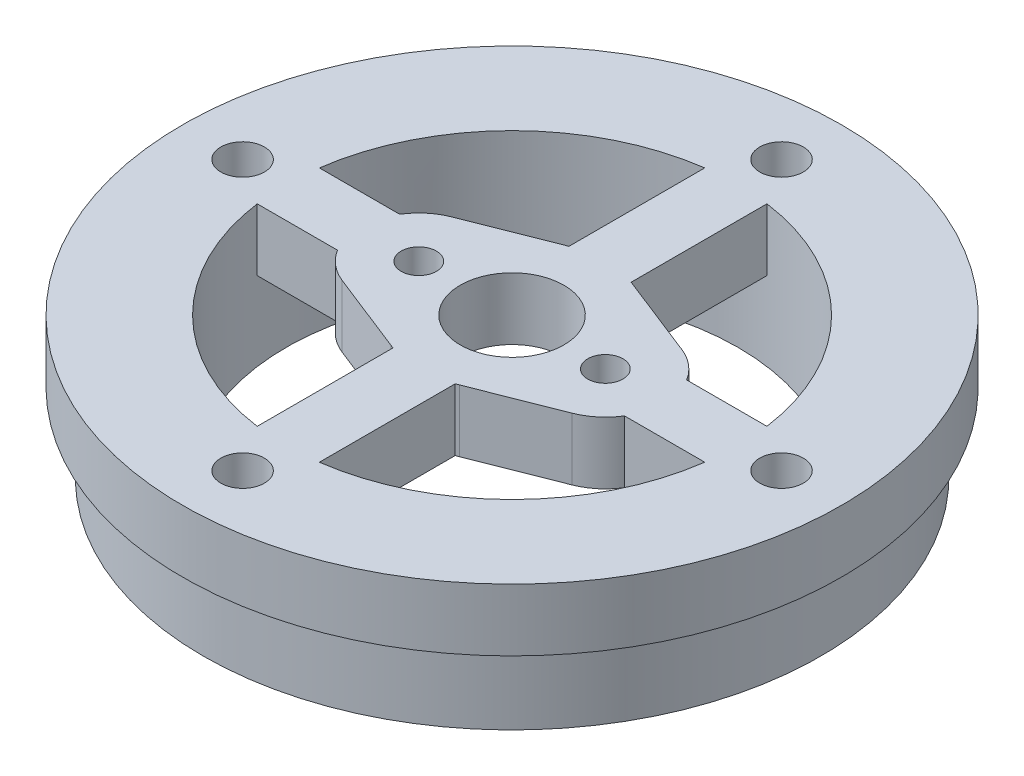
ISO-10303-21;
HEADER;
FILE_DESCRIPTION(('STEP AP214'),'2;1');
FILE_NAME('part.step','',(''),(''),'','','');
FILE_SCHEMA(('AUTOMOTIVE_DESIGN { 1 0 10303 214 1 1 1 1 }'));
ENDSEC;
DATA;
#1=APPLICATION_CONTEXT('core data for automotive mechanical design processes');
#2=APPLICATION_PROTOCOL_DEFINITION('international standard','automotive_design',2000,#1);
#3=PRODUCT_CONTEXT('',#1,'mechanical');
#4=PRODUCT('Part','Part','',(#3));
#5=PRODUCT_RELATED_PRODUCT_CATEGORY('part','',(#4));
#6=PRODUCT_DEFINITION_FORMATION('','',#4);
#7=PRODUCT_DEFINITION_CONTEXT('part definition',#1,'design');
#8=PRODUCT_DEFINITION('design','',#6,#7);
#9=PRODUCT_DEFINITION_SHAPE('','',#8);
#10=(LENGTH_UNIT() NAMED_UNIT(*) SI_UNIT(.MILLI.,.METRE.));
#11=(NAMED_UNIT(*) PLANE_ANGLE_UNIT() SI_UNIT($,.RADIAN.));
#12=(NAMED_UNIT(*) SI_UNIT($,.STERADIAN.) SOLID_ANGLE_UNIT());
#13=UNCERTAINTY_MEASURE_WITH_UNIT(LENGTH_MEASURE(1.E-05),#10,'distance_accuracy_value','');
#14=(GEOMETRIC_REPRESENTATION_CONTEXT(3) GLOBAL_UNCERTAINTY_ASSIGNED_CONTEXT((#13)) GLOBAL_UNIT_ASSIGNED_CONTEXT((#10,
#11,#12)) REPRESENTATION_CONTEXT('',''));
#15=CARTESIAN_POINT('',(0.,0.,0.));
#16=DIRECTION('',(0.,0.,1.));
#17=DIRECTION('',(1.,0.,0.));
#18=AXIS2_PLACEMENT_3D('',#15,#16,#17);
#19=CARTESIAN_POINT('',(10.9,3.8,0.));
#20=DIRECTION('',(0.,-1.,0.));
#21=DIRECTION('',(0.,0.,-1.));
#22=AXIS2_PLACEMENT_3D('',#19,#20,#21);
#23=PLANE('',#22);
#24=CARTESIAN_POINT('',(4.5,3.8,0.));
#25=DIRECTION('',(0.,-1.,0.));
#26=DIRECTION('',(0.,0.,-1.));
#27=AXIS2_PLACEMENT_3D('',#24,#25,#26);
#28=CIRCLE('',#27,0.849999999999999);
#29=CARTESIAN_POINT('',(4.5,3.8,-0.849999999999999));
#30=VERTEX_POINT('',#29);
#31=EDGE_CURVE('E317',#30,#30,#28,.T.);
#32=ORIENTED_EDGE('',*,*,#31,.F.);
#33=EDGE_LOOP('',(#32));
#34=FACE_BOUND('',#33,.T.);
#35=CARTESIAN_POINT('',(-4.5,3.8,0.));
#36=DIRECTION('',(0.,-1.,0.));
#37=DIRECTION('',(0.,0.,-1.));
#38=AXIS2_PLACEMENT_3D('',#35,#36,#37);
#39=CIRCLE('',#38,0.849999999999999);
#40=CARTESIAN_POINT('',(-4.5,3.8,-0.849999999999999));
#41=VERTEX_POINT('',#40);
#42=EDGE_CURVE('E324',#41,#41,#39,.T.);
#43=ORIENTED_EDGE('',*,*,#42,.F.);
#44=EDGE_LOOP('',(#43));
#45=FACE_BOUND('',#44,.T.);
#46=CARTESIAN_POINT('',(0.,3.8,0.));
#47=DIRECTION('',(0.,-1.,0.));
#48=DIRECTION('',(0.,0.,-1.));
#49=AXIS2_PLACEMENT_3D('',#46,#47,#48);
#50=CIRCLE('',#49,2.5);
#51=CARTESIAN_POINT('',(0.,3.8,-2.5));
#52=VERTEX_POINT('',#51);
#53=EDGE_CURVE('E229',#52,#52,#50,.T.);
#54=ORIENTED_EDGE('',*,*,#53,.F.);
#55=EDGE_LOOP('',(#54));
#56=FACE_BOUND('',#55,.T.);
#57=CARTESIAN_POINT('',(0.,3.8,0.));
#58=DIRECTION('',(0.,-1.,0.));
#59=DIRECTION('',(0.,0.,-1.));
#60=AXIS2_PLACEMENT_3D('',#57,#58,#59);
#61=CIRCLE('',#60,4.5);
#62=CARTESIAN_POINT('',(-1.65,3.8,-4.18658572108586));
#63=VERTEX_POINT('',#62);
#64=CARTESIAN_POINT('',(-1.5,3.8,-4.24264068711929));
#65=VERTEX_POINT('',#64);
#66=EDGE_CURVE('E55',#63,#65,#61,.T.);
#67=ORIENTED_EDGE('',*,*,#66,.T.);
#68=DIRECTION('',(0.,0.,-1.));
#69=VECTOR('',#68,1.);
#70=CARTESIAN_POINT('',(-1.5,3.8,0.));
#71=LINE('',#70,#69);
#72=CARTESIAN_POINT('',(-1.5,3.8,-10.7962956610126));
#73=VERTEX_POINT('',#72);
#74=EDGE_CURVE('E230',#65,#73,#71,.T.);
#75=ORIENTED_EDGE('',*,*,#74,.T.);
#76=CARTESIAN_POINT('',(0.,3.8,0.));
#77=DIRECTION('',(0.,-1.,0.));
#78=DIRECTION('',(0.,0.,-1.));
#79=AXIS2_PLACEMENT_3D('',#76,#77,#78);
#80=CIRCLE('',#79,10.9);
#81=CARTESIAN_POINT('',(1.5,3.8,-10.7962956610126));
#82=VERTEX_POINT('',#81);
#83=EDGE_CURVE('E206',#73,#82,#80,.T.);
#84=ORIENTED_EDGE('',*,*,#83,.T.);
#85=DIRECTION('',(0.,0.,-1.));
#86=VECTOR('',#85,1.);
#87=CARTESIAN_POINT('',(1.5,3.8,0.));
#88=LINE('',#87,#86);
#89=CARTESIAN_POINT('',(1.5,3.8,-4.24264068711929));
#90=VERTEX_POINT('',#89);
#91=EDGE_CURVE('E220',#90,#82,#88,.T.);
#92=ORIENTED_EDGE('',*,*,#91,.F.);
#93=CARTESIAN_POINT('',(0.,3.8,0.));
#94=DIRECTION('',(0.,-1.,0.));
#95=DIRECTION('',(0.,0.,-1.));
#96=AXIS2_PLACEMENT_3D('',#93,#94,#95);
#97=CIRCLE('',#96,4.5);
#98=CARTESIAN_POINT('',(1.65,3.8,-4.18658572108586));
#99=VERTEX_POINT('',#98);
#100=EDGE_CURVE('E224',#90,#99,#97,.T.);
#101=ORIENTED_EDGE('',*,*,#100,.T.);
#102=DIRECTION('',(-0.930352382463524,0.,-0.366666666666667));
#103=VECTOR('',#102,1.);
#104=CARTESIAN_POINT('',(1.65,3.8,-4.18658572108586));
#105=LINE('',#104,#103);
#106=CARTESIAN_POINT('',(5.545,3.8,-2.65150429002104));
#107=VERTEX_POINT('',#106);
#108=EDGE_CURVE('E768',#107,#99,#105,.T.);
#109=ORIENTED_EDGE('',*,*,#108,.F.);
#110=CARTESIAN_POINT('',(4.5,3.8,0.));
#111=DIRECTION('',(0.,-1.,0.));
#112=DIRECTION('',(0.,0.,-1.));
#113=AXIS2_PLACEMENT_3D('',#110,#111,#112);
#114=CIRCLE('',#113,2.85);
#115=CARTESIAN_POINT('',(6.92332416321053,3.8,-1.5));
#116=VERTEX_POINT('',#115);
#117=EDGE_CURVE('E761',#107,#116,#114,.T.);
#118=ORIENTED_EDGE('',*,*,#117,.T.);
#119=DIRECTION('',(1.,0.,0.));
#120=VECTOR('',#119,1.);
#121=CARTESIAN_POINT('',(0.,3.8,-1.50000000000001));
#122=LINE('',#121,#120);
#123=CARTESIAN_POINT('',(10.7962956610126,3.8,-1.5));
#124=VERTEX_POINT('',#123);
#125=EDGE_CURVE('E225',#116,#124,#122,.T.);
#126=ORIENTED_EDGE('',*,*,#125,.T.);
#127=CARTESIAN_POINT('',(10.7962956610126,3.8,1.5));
#128=VERTEX_POINT('',#127);
#129=EDGE_CURVE('E231',#124,#128,#80,.T.);
#130=ORIENTED_EDGE('',*,*,#129,.T.);
#131=DIRECTION('',(1.,0.,0.));
#132=VECTOR('',#131,1.);
#133=CARTESIAN_POINT('',(0.,3.8,1.5));
#134=LINE('',#133,#132);
#135=CARTESIAN_POINT('',(6.92332416321053,3.8,1.5));
#136=VERTEX_POINT('',#135);
#137=EDGE_CURVE('E473',#136,#128,#134,.T.);
#138=ORIENTED_EDGE('',*,*,#137,.F.);
#139=CARTESIAN_POINT('',(4.5,3.8,0.));
#140=DIRECTION('',(0.,-1.,0.));
#141=DIRECTION('',(0.,0.,-1.));
#142=AXIS2_PLACEMENT_3D('',#139,#140,#141);
#143=CIRCLE('',#142,2.85);
#144=CARTESIAN_POINT('',(5.545,3.8,2.65150429002104));
#145=VERTEX_POINT('',#144);
#146=EDGE_CURVE('E467',#136,#145,#143,.T.);
#147=ORIENTED_EDGE('',*,*,#146,.T.);
#148=DIRECTION('',(0.930352382463524,0.,-0.366666666666667));
#149=VECTOR('',#148,1.);
#150=CARTESIAN_POINT('',(1.65,3.8,4.18658572108586));
#151=LINE('',#150,#149);
#152=CARTESIAN_POINT('',(1.65,3.8,4.18658572108586));
#153=VERTEX_POINT('',#152);
#154=EDGE_CURVE('E464',#153,#145,#151,.T.);
#155=ORIENTED_EDGE('',*,*,#154,.F.);
#156=CARTESIAN_POINT('',(0.,3.8,0.));
#157=DIRECTION('',(0.,-1.,0.));
#158=DIRECTION('',(0.,0.,-1.));
#159=AXIS2_PLACEMENT_3D('',#156,#157,#158);
#160=CIRCLE('',#159,4.5);
#161=CARTESIAN_POINT('',(1.5,3.8,4.24264068711929));
#162=VERTEX_POINT('',#161);
#163=EDGE_CURVE('E58',#153,#162,#160,.T.);
#164=ORIENTED_EDGE('',*,*,#163,.T.);
#165=DIRECTION('',(0.,0.,1.));
#166=VECTOR('',#165,1.);
#167=CARTESIAN_POINT('',(1.5,3.8,0.));
#168=LINE('',#167,#166);
#169=CARTESIAN_POINT('',(1.5,3.8,10.7962956610126));
#170=VERTEX_POINT('',#169);
#171=EDGE_CURVE('E252',#162,#170,#168,.T.);
#172=ORIENTED_EDGE('',*,*,#171,.T.);
#173=CARTESIAN_POINT('',(-1.5,3.8,10.7962956610126));
#174=VERTEX_POINT('',#173);
#175=EDGE_CURVE('E232',#170,#174,#80,.T.);
#176=ORIENTED_EDGE('',*,*,#175,.T.);
#177=DIRECTION('',(0.,0.,1.));
#178=VECTOR('',#177,1.);
#179=CARTESIAN_POINT('',(-1.5,3.8,0.));
#180=LINE('',#179,#178);
#181=CARTESIAN_POINT('',(-1.5,3.8,4.24264068711929));
#182=VERTEX_POINT('',#181);
#183=EDGE_CURVE('E249',#182,#174,#180,.T.);
#184=ORIENTED_EDGE('',*,*,#183,.F.);
#185=CARTESIAN_POINT('',(0.,3.8,0.));
#186=DIRECTION('',(0.,-1.,0.));
#187=DIRECTION('',(0.,0.,-1.));
#188=AXIS2_PLACEMENT_3D('',#185,#186,#187);
#189=CIRCLE('',#188,4.5);
#190=CARTESIAN_POINT('',(-1.65,3.8,4.18658572108586));
#191=VERTEX_POINT('',#190);
#192=EDGE_CURVE('E269',#182,#191,#189,.T.);
#193=ORIENTED_EDGE('',*,*,#192,.T.);
#194=DIRECTION('',(-0.930352382463524,0.,-0.366666666666667));
#195=VECTOR('',#194,1.);
#196=CARTESIAN_POINT('',(-1.65,3.8,4.18658572108586));
#197=LINE('',#196,#195);
#198=CARTESIAN_POINT('',(-5.545,3.8,2.65150429002104));
#199=VERTEX_POINT('',#198);
#200=EDGE_CURVE('E282',#191,#199,#197,.T.);
#201=ORIENTED_EDGE('',*,*,#200,.T.);
#202=CARTESIAN_POINT('',(-4.5,3.8,0.));
#203=DIRECTION('',(0.,-1.,0.));
#204=DIRECTION('',(0.,0.,-1.));
#205=AXIS2_PLACEMENT_3D('',#202,#203,#204);
#206=CIRCLE('',#205,2.85);
#207=CARTESIAN_POINT('',(-6.92332416321053,3.8,1.5));
#208=VERTEX_POINT('',#207);
#209=EDGE_CURVE('E272',#199,#208,#206,.T.);
#210=ORIENTED_EDGE('',*,*,#209,.T.);
#211=DIRECTION('',(-1.,0.,0.));
#212=VECTOR('',#211,1.);
#213=CARTESIAN_POINT('',(0.,3.8,1.5));
#214=LINE('',#213,#212);
#215=CARTESIAN_POINT('',(-10.7962956610126,3.8,1.5));
#216=VERTEX_POINT('',#215);
#217=EDGE_CURVE('E267',#208,#216,#214,.T.);
#218=ORIENTED_EDGE('',*,*,#217,.T.);
#219=CARTESIAN_POINT('',(-10.7962956610126,3.8,-1.5));
#220=VERTEX_POINT('',#219);
#221=EDGE_CURVE('E228',#216,#220,#80,.T.);
#222=ORIENTED_EDGE('',*,*,#221,.T.);
#223=DIRECTION('',(-1.,0.,0.));
#224=VECTOR('',#223,1.);
#225=CARTESIAN_POINT('',(0.,3.8,-1.5));
#226=LINE('',#225,#224);
#227=CARTESIAN_POINT('',(-6.92332416321053,3.8,-1.5));
#228=VERTEX_POINT('',#227);
#229=EDGE_CURVE('E740',#228,#220,#226,.T.);
#230=ORIENTED_EDGE('',*,*,#229,.F.);
#231=CARTESIAN_POINT('',(-4.5,3.8,0.));
#232=DIRECTION('',(0.,-1.,0.));
#233=DIRECTION('',(0.,0.,-1.));
#234=AXIS2_PLACEMENT_3D('',#231,#232,#233);
#235=CIRCLE('',#234,2.85);
#236=CARTESIAN_POINT('',(-5.545,3.8,-2.65150429002104));
#237=VERTEX_POINT('',#236);
#238=EDGE_CURVE('E733',#228,#237,#235,.T.);
#239=ORIENTED_EDGE('',*,*,#238,.T.);
#240=DIRECTION('',(0.930352382463524,0.,-0.366666666666667));
#241=VECTOR('',#240,1.);
#242=CARTESIAN_POINT('',(-1.65,3.8,-4.18658572108586));
#243=LINE('',#242,#241);
#244=EDGE_CURVE('E732',#237,#63,#243,.T.);
#245=ORIENTED_EDGE('',*,*,#244,.T.);
#246=EDGE_LOOP('',(#67,#75,#84,#92,#101,#109,#118,#126,#130,#138,#147,#155,#164,#172,#176,#184,
#193,#201,#210,#218,#222,#230,#239,#245));
#247=FACE_BOUND('',#246,.T.);
#248=ADVANCED_FACE('F40',(#34,#45,#56,#247),#23,.T.);
#249=CARTESIAN_POINT('',(2.5,6.8,0.));
#250=DIRECTION('',(0.,1.,0.));
#251=DIRECTION('',(0.,0.,1.));
#252=AXIS2_PLACEMENT_3D('',#249,#250,#251);
#253=PLANE('',#252);
#254=CARTESIAN_POINT('',(13.,6.8,0.));
#255=DIRECTION('',(0.,-1.,0.));
#256=DIRECTION('',(0.,0.,-1.));
#257=AXIS2_PLACEMENT_3D('',#254,#255,#256);
#258=CIRCLE('',#257,1.05);
#259=CARTESIAN_POINT('',(13.,6.8,-1.05));
#260=VERTEX_POINT('',#259);
#261=EDGE_CURVE('E293',#260,#260,#258,.T.);
#262=ORIENTED_EDGE('',*,*,#261,.T.);
#263=EDGE_LOOP('',(#262));
#264=FACE_BOUND('',#263,.T.);
#265=CARTESIAN_POINT('',(0.,6.8,-13.));
#266=DIRECTION('',(0.,-1.,0.));
#267=DIRECTION('',(0.,0.,-1.));
#268=AXIS2_PLACEMENT_3D('',#265,#266,#267);
#269=CIRCLE('',#268,1.05);
#270=CARTESIAN_POINT('',(0.,6.8,-14.05));
#271=VERTEX_POINT('',#270);
#272=EDGE_CURVE('E301',#271,#271,#269,.T.);
#273=ORIENTED_EDGE('',*,*,#272,.T.);
#274=EDGE_LOOP('',(#273));
#275=FACE_BOUND('',#274,.T.);
#276=CARTESIAN_POINT('',(-13.,6.8,0.));
#277=DIRECTION('',(0.,-1.,0.));
#278=DIRECTION('',(0.,0.,-1.));
#279=AXIS2_PLACEMENT_3D('',#276,#277,#278);
#280=CIRCLE('',#279,1.05);
#281=CARTESIAN_POINT('',(-13.,6.8,-1.05));
#282=VERTEX_POINT('',#281);
#283=EDGE_CURVE('E307',#282,#282,#280,.T.);
#284=ORIENTED_EDGE('',*,*,#283,.T.);
#285=EDGE_LOOP('',(#284));
#286=FACE_BOUND('',#285,.T.);
#287=CARTESIAN_POINT('',(0.,6.8,13.));
#288=DIRECTION('',(0.,-1.,0.));
#289=DIRECTION('',(0.,0.,-1.));
#290=AXIS2_PLACEMENT_3D('',#287,#288,#289);
#291=CIRCLE('',#290,1.05);
#292=CARTESIAN_POINT('',(0.,6.8,11.95));
#293=VERTEX_POINT('',#292);
#294=EDGE_CURVE('E311',#293,#293,#291,.T.);
#295=ORIENTED_EDGE('',*,*,#294,.T.);
#296=EDGE_LOOP('',(#295));
#297=FACE_BOUND('',#296,.T.);
#298=CARTESIAN_POINT('',(4.5,6.8,0.));
#299=DIRECTION('',(0.,1.,0.));
#300=DIRECTION('',(0.,0.,1.));
#301=AXIS2_PLACEMENT_3D('',#298,#299,#300);
#302=CIRCLE('',#301,0.849999999999999);
#303=CARTESIAN_POINT('',(4.5,6.8,0.849999999999999));
#304=VERTEX_POINT('',#303);
#305=EDGE_CURVE('E316',#304,#304,#302,.T.);
#306=ORIENTED_EDGE('',*,*,#305,.F.);
#307=EDGE_LOOP('',(#306));
#308=FACE_BOUND('',#307,.T.);
#309=CARTESIAN_POINT('',(-4.5,6.8,0.));
#310=DIRECTION('',(0.,1.,0.));
#311=DIRECTION('',(0.,0.,1.));
#312=AXIS2_PLACEMENT_3D('',#309,#310,#311);
#313=CIRCLE('',#312,0.849999999999999);
#314=CARTESIAN_POINT('',(-4.5,6.8,0.849999999999999));
#315=VERTEX_POINT('',#314);
#316=EDGE_CURVE('E325',#315,#315,#313,.T.);
#317=ORIENTED_EDGE('',*,*,#316,.F.);
#318=EDGE_LOOP('',(#317));
#319=FACE_BOUND('',#318,.T.);
#320=CARTESIAN_POINT('',(0.,6.8,0.));
#321=DIRECTION('',(0.,-1.,0.));
#322=DIRECTION('',(0.,0.,-1.));
#323=AXIS2_PLACEMENT_3D('',#320,#321,#322);
#324=CIRCLE('',#323,2.5);
#325=CARTESIAN_POINT('',(0.,6.8,-2.5));
#326=VERTEX_POINT('',#325);
#327=EDGE_CURVE('E234',#326,#326,#324,.T.);
#328=ORIENTED_EDGE('',*,*,#327,.T.);
#329=EDGE_LOOP('',(#328));
#330=FACE_BOUND('',#329,.T.);
#331=CARTESIAN_POINT('',(0.,6.8,0.));
#332=DIRECTION('',(0.,-1.,0.));
#333=DIRECTION('',(0.,0.,-1.));
#334=AXIS2_PLACEMENT_3D('',#331,#332,#333);
#335=CIRCLE('',#334,15.9);
#336=CARTESIAN_POINT('',(0.,6.8,-15.9));
#337=VERTEX_POINT('',#336);
#338=EDGE_CURVE('E327',#337,#337,#335,.T.);
#339=ORIENTED_EDGE('',*,*,#338,.F.);
#340=EDGE_LOOP('',(#339));
#341=FACE_BOUND('',#340,.T.);
#342=DIRECTION('',(0.930352382463524,0.,0.366666666666667));
#343=VECTOR('',#342,1.);
#344=CARTESIAN_POINT('',(0.513888888888883,6.8,5.03940873834409));
#345=LINE('',#344,#343);
#346=CARTESIAN_POINT('',(-5.545,6.8,2.65150429002104));
#347=VERTEX_POINT('',#346);
#348=CARTESIAN_POINT('',(-1.65,6.8,4.18658572108586));
#349=VERTEX_POINT('',#348);
#350=EDGE_CURVE('E397',#347,#349,#345,.T.);
#351=ORIENTED_EDGE('',*,*,#350,.T.);
#352=CARTESIAN_POINT('',(0.,6.8,0.));
#353=DIRECTION('',(0.,1.,0.));
#354=DIRECTION('',(0.,0.,1.));
#355=AXIS2_PLACEMENT_3D('',#352,#353,#354);
#356=CIRCLE('',#355,4.5);
#357=CARTESIAN_POINT('',(-1.5,6.8,4.24264068711929));
#358=VERTEX_POINT('',#357);
#359=EDGE_CURVE('E402',#349,#358,#356,.T.);
#360=ORIENTED_EDGE('',*,*,#359,.T.);
#361=DIRECTION('',(0.,0.,-1.));
#362=VECTOR('',#361,1.);
#363=CARTESIAN_POINT('',(-1.5,6.8,0.));
#364=LINE('',#363,#362);
#365=CARTESIAN_POINT('',(-1.5,6.8,10.7962956610126));
#366=VERTEX_POINT('',#365);
#367=EDGE_CURVE('E384',#366,#358,#364,.T.);
#368=ORIENTED_EDGE('',*,*,#367,.F.);
#369=CARTESIAN_POINT('',(0.,6.8,0.));
#370=DIRECTION('',(0.,1.,0.));
#371=DIRECTION('',(0.,0.,1.));
#372=AXIS2_PLACEMENT_3D('',#369,#370,#371);
#373=CIRCLE('',#372,10.9);
#374=CARTESIAN_POINT('',(-10.7962956610126,6.8,1.5));
#375=VERTEX_POINT('',#374);
#376=EDGE_CURVE('E257',#375,#366,#373,.T.);
#377=ORIENTED_EDGE('',*,*,#376,.F.);
#378=DIRECTION('',(1.,0.,0.));
#379=VECTOR('',#378,1.);
#380=CARTESIAN_POINT('',(2.5,6.8,1.5));
#381=LINE('',#380,#379);
#382=CARTESIAN_POINT('',(-6.92332416321053,6.8,1.5));
#383=VERTEX_POINT('',#382);
#384=EDGE_CURVE('E395',#375,#383,#381,.T.);
#385=ORIENTED_EDGE('',*,*,#384,.T.);
#386=CARTESIAN_POINT('',(-4.5,6.8,0.));
#387=DIRECTION('',(0.,1.,0.));
#388=DIRECTION('',(0.,0.,1.));
#389=AXIS2_PLACEMENT_3D('',#386,#387,#388);
#390=CIRCLE('',#389,2.85);
#391=EDGE_CURVE('E391',#383,#347,#390,.T.);
#392=ORIENTED_EDGE('',*,*,#391,.T.);
#393=EDGE_LOOP('',(#351,#360,#368,#377,#385,#392));
#394=FACE_BOUND('',#393,.T.);
#395=DIRECTION('',(0.930352382463524,0.,0.366666666666667));
#396=VECTOR('',#395,1.);
#397=CARTESIAN_POINT('',(3.81388888888889,6.8,-3.33376270382763));
#398=LINE('',#397,#396);
#399=CARTESIAN_POINT('',(1.65,6.8,-4.18658572108586));
#400=VERTEX_POINT('',#399);
#401=CARTESIAN_POINT('',(5.545,6.8,-2.65150429002104));
#402=VERTEX_POINT('',#401);
#403=EDGE_CURVE('E412',#400,#402,#398,.T.);
#404=ORIENTED_EDGE('',*,*,#403,.F.);
#405=CARTESIAN_POINT('',(0.,6.8,0.));
#406=DIRECTION('',(0.,1.,0.));
#407=DIRECTION('',(0.,0.,1.));
#408=AXIS2_PLACEMENT_3D('',#405,#406,#407);
#409=CIRCLE('',#408,4.5);
#410=CARTESIAN_POINT('',(1.5,6.8,-4.24264068711929));
#411=VERTEX_POINT('',#410);
#412=EDGE_CURVE('E414',#400,#411,#409,.T.);
#413=ORIENTED_EDGE('',*,*,#412,.T.);
#414=DIRECTION('',(0.,0.,1.));
#415=VECTOR('',#414,1.);
#416=CARTESIAN_POINT('',(1.5,6.8,0.));
#417=LINE('',#416,#415);
#418=CARTESIAN_POINT('',(1.5,6.8,-10.7962956610126));
#419=VERTEX_POINT('',#418);
#420=EDGE_CURVE('E404',#419,#411,#417,.T.);
#421=ORIENTED_EDGE('',*,*,#420,.F.);
#422=CARTESIAN_POINT('',(0.,6.8,0.));
#423=DIRECTION('',(0.,1.,0.));
#424=DIRECTION('',(0.,0.,1.));
#425=AXIS2_PLACEMENT_3D('',#422,#423,#424);
#426=CIRCLE('',#425,10.9);
#427=CARTESIAN_POINT('',(10.7962956610126,6.8,-1.5));
#428=VERTEX_POINT('',#427);
#429=EDGE_CURVE('E207',#428,#419,#426,.T.);
#430=ORIENTED_EDGE('',*,*,#429,.F.);
#431=DIRECTION('',(-1.,0.,0.));
#432=VECTOR('',#431,1.);
#433=CARTESIAN_POINT('',(2.5,6.8,-1.50000000000001));
#434=LINE('',#433,#432);
#435=CARTESIAN_POINT('',(6.92332416321053,6.8,-1.5));
#436=VERTEX_POINT('',#435);
#437=EDGE_CURVE('E410',#428,#436,#434,.T.);
#438=ORIENTED_EDGE('',*,*,#437,.T.);
#439=CARTESIAN_POINT('',(4.5,6.8,0.));
#440=DIRECTION('',(0.,1.,0.));
#441=DIRECTION('',(0.,0.,1.));
#442=AXIS2_PLACEMENT_3D('',#439,#440,#441);
#443=CIRCLE('',#442,2.85);
#444=EDGE_CURVE('E406',#436,#402,#443,.T.);
#445=ORIENTED_EDGE('',*,*,#444,.T.);
#446=EDGE_LOOP('',(#404,#413,#421,#430,#438,#445));
#447=FACE_BOUND('',#446,.T.);
#448=DIRECTION('',(0.,0.,-1.));
#449=VECTOR('',#448,1.);
#450=CARTESIAN_POINT('',(1.5,6.8,0.));
#451=LINE('',#450,#449);
#452=CARTESIAN_POINT('',(1.5,6.8,10.7962956610126));
#453=VERTEX_POINT('',#452);
#454=CARTESIAN_POINT('',(1.5,6.8,4.24264068711929));
#455=VERTEX_POINT('',#454);
#456=EDGE_CURVE('E430',#453,#455,#451,.T.);
#457=ORIENTED_EDGE('',*,*,#456,.T.);
#458=CARTESIAN_POINT('',(0.,6.8,0.));
#459=DIRECTION('',(0.,1.,0.));
#460=DIRECTION('',(0.,0.,1.));
#461=AXIS2_PLACEMENT_3D('',#458,#459,#460);
#462=CIRCLE('',#461,4.5);
#463=CARTESIAN_POINT('',(1.65,6.8,4.18658572108586));
#464=VERTEX_POINT('',#463);
#465=EDGE_CURVE('E429',#455,#464,#462,.T.);
#466=ORIENTED_EDGE('',*,*,#465,.T.);
#467=DIRECTION('',(-0.930352382463524,0.,0.366666666666667));
#468=VECTOR('',#467,1.);
#469=CARTESIAN_POINT('',(3.81388888888889,6.8,3.33376270382763));
#470=LINE('',#469,#468);
#471=CARTESIAN_POINT('',(5.545,6.8,2.65150429002104));
#472=VERTEX_POINT('',#471);
#473=EDGE_CURVE('E416',#472,#464,#470,.T.);
#474=ORIENTED_EDGE('',*,*,#473,.F.);
#475=CARTESIAN_POINT('',(4.5,6.8,0.));
#476=DIRECTION('',(0.,1.,0.));
#477=DIRECTION('',(0.,0.,1.));
#478=AXIS2_PLACEMENT_3D('',#475,#476,#477);
#479=CIRCLE('',#478,2.85);
#480=CARTESIAN_POINT('',(6.92332416321053,6.8,1.5));
#481=VERTEX_POINT('',#480);
#482=EDGE_CURVE('E419',#472,#481,#479,.T.);
#483=ORIENTED_EDGE('',*,*,#482,.T.);
#484=DIRECTION('',(-1.,0.,0.));
#485=VECTOR('',#484,1.);
#486=CARTESIAN_POINT('',(2.5,6.8,1.5));
#487=LINE('',#486,#485);
#488=CARTESIAN_POINT('',(10.7962956610126,6.8,1.5));
#489=VERTEX_POINT('',#488);
#490=EDGE_CURVE('E421',#489,#481,#487,.T.);
#491=ORIENTED_EDGE('',*,*,#490,.F.);
#492=CARTESIAN_POINT('',(0.,6.8,0.));
#493=DIRECTION('',(0.,1.,0.));
#494=DIRECTION('',(0.,0.,1.));
#495=AXIS2_PLACEMENT_3D('',#492,#493,#494);
#496=CIRCLE('',#495,10.9);
#497=EDGE_CURVE('E422',#453,#489,#496,.T.);
#498=ORIENTED_EDGE('',*,*,#497,.F.);
#499=EDGE_LOOP('',(#457,#466,#474,#483,#491,#498));
#500=FACE_BOUND('',#499,.T.);
#501=DIRECTION('',(0.,0.,1.));
#502=VECTOR('',#501,1.);
#503=CARTESIAN_POINT('',(-1.5,6.8,0.));
#504=LINE('',#503,#502);
#505=CARTESIAN_POINT('',(-1.5,6.8,-10.7962956610126));
#506=VERTEX_POINT('',#505);
#507=CARTESIAN_POINT('',(-1.5,6.8,-4.24264068711929));
#508=VERTEX_POINT('',#507);
#509=EDGE_CURVE('E44',#506,#508,#504,.T.);
#510=ORIENTED_EDGE('',*,*,#509,.T.);
#511=CARTESIAN_POINT('',(0.,6.8,0.));
#512=DIRECTION('',(0.,1.,0.));
#513=DIRECTION('',(0.,0.,1.));
#514=AXIS2_PLACEMENT_3D('',#511,#512,#513);
#515=CIRCLE('',#514,4.5);
#516=CARTESIAN_POINT('',(-1.65,6.8,-4.18658572108586));
#517=VERTEX_POINT('',#516);
#518=EDGE_CURVE('E11',#508,#517,#515,.T.);
#519=ORIENTED_EDGE('',*,*,#518,.T.);
#520=DIRECTION('',(-0.930352382463524,0.,0.366666666666667));
#521=VECTOR('',#520,1.);
#522=CARTESIAN_POINT('',(0.513888888888886,6.8,-5.03940873834409));
#523=LINE('',#522,#521);
#524=CARTESIAN_POINT('',(-5.545,6.8,-2.65150429002104));
#525=VERTEX_POINT('',#524);
#526=EDGE_CURVE('E433',#517,#525,#523,.T.);
#527=ORIENTED_EDGE('',*,*,#526,.T.);
#528=CARTESIAN_POINT('',(-4.5,6.8,0.));
#529=DIRECTION('',(0.,1.,0.));
#530=DIRECTION('',(0.,0.,1.));
#531=AXIS2_PLACEMENT_3D('',#528,#529,#530);
#532=CIRCLE('',#531,2.85);
#533=CARTESIAN_POINT('',(-6.92332416321053,6.8,-1.5));
#534=VERTEX_POINT('',#533);
#535=EDGE_CURVE('E436',#525,#534,#532,.T.);
#536=ORIENTED_EDGE('',*,*,#535,.T.);
#537=DIRECTION('',(1.,0.,0.));
#538=VECTOR('',#537,1.);
#539=CARTESIAN_POINT('',(2.5,6.8,-1.5));
#540=LINE('',#539,#538);
#541=CARTESIAN_POINT('',(-10.7962956610126,6.8,-1.5));
#542=VERTEX_POINT('',#541);
#543=EDGE_CURVE('E438',#542,#534,#540,.T.);
#544=ORIENTED_EDGE('',*,*,#543,.F.);
#545=CARTESIAN_POINT('',(0.,6.8,0.));
#546=DIRECTION('',(0.,1.,0.));
#547=DIRECTION('',(0.,0.,1.));
#548=AXIS2_PLACEMENT_3D('',#545,#546,#547);
#549=CIRCLE('',#548,10.9);
#550=EDGE_CURVE('E442',#506,#542,#549,.T.);
#551=ORIENTED_EDGE('',*,*,#550,.F.);
#552=EDGE_LOOP('',(#510,#519,#527,#536,#544,#551));
#553=FACE_BOUND('',#552,.T.);
#554=ADVANCED_FACE('F331',(#264,#275,#286,#297,#308,#319,#330,#341,#394,#447,#500,#553),#253,.T.);
#555=CARTESIAN_POINT('',(0.,0.,0.));
#556=DIRECTION('',(0.,-1.,0.));
#557=DIRECTION('',(0.,0.,-1.));
#558=AXIS2_PLACEMENT_3D('',#555,#556,#557);
#559=CYLINDRICAL_SURFACE('',#558,15.9);
#560=ORIENTED_EDGE('',*,*,#338,.T.);
#561=EDGE_LOOP('',(#560));
#562=FACE_BOUND('',#561,.T.);
#563=CARTESIAN_POINT('',(0.,3.8,0.));
#564=DIRECTION('',(0.,-1.,0.));
#565=DIRECTION('',(0.,0.,-1.));
#566=AXIS2_PLACEMENT_3D('',#563,#564,#565);
#567=CIRCLE('',#566,15.9);
#568=CARTESIAN_POINT('',(0.,3.8,-15.9));
#569=VERTEX_POINT('',#568);
#570=EDGE_CURVE('E379',#569,#569,#567,.T.);
#571=ORIENTED_EDGE('',*,*,#570,.F.);
#572=EDGE_LOOP('',(#571));
#573=FACE_BOUND('',#572,.T.);
#574=ADVANCED_FACE('F39',(#562,#573),#559,.T.);
#575=CARTESIAN_POINT('',(15.9,3.8,0.));
#576=DIRECTION('',(0.,-1.,0.));
#577=DIRECTION('',(0.,0.,-1.));
#578=AXIS2_PLACEMENT_3D('',#575,#576,#577);
#579=PLANE('',#578);
#580=ORIENTED_EDGE('',*,*,#570,.T.);
#581=EDGE_LOOP('',(#580));
#582=FACE_BOUND('',#581,.T.);
#583=CARTESIAN_POINT('',(0.,3.8,0.));
#584=DIRECTION('',(0.,-1.,0.));
#585=DIRECTION('',(0.,0.,-1.));
#586=AXIS2_PLACEMENT_3D('',#583,#584,#585);
#587=CIRCLE('',#586,14.9);
#588=CARTESIAN_POINT('',(0.,3.8,-14.9));
#589=VERTEX_POINT('',#588);
#590=EDGE_CURVE('E382',#589,#589,#587,.T.);
#591=ORIENTED_EDGE('',*,*,#590,.F.);
#592=EDGE_LOOP('',(#591));
#593=FACE_BOUND('',#592,.T.);
#594=ADVANCED_FACE('F369',(#582,#593),#579,.T.);
#595=CARTESIAN_POINT('',(0.,0.,0.));
#596=DIRECTION('',(0.,-1.,0.));
#597=DIRECTION('',(0.,0.,-1.));
#598=AXIS2_PLACEMENT_3D('',#595,#596,#597);
#599=CYLINDRICAL_SURFACE('',#598,14.9);
#600=ORIENTED_EDGE('',*,*,#590,.T.);
#601=EDGE_LOOP('',(#600));
#602=FACE_BOUND('',#601,.T.);
#603=CARTESIAN_POINT('',(0.,0.,0.));
#604=DIRECTION('',(0.,-1.,0.));
#605=DIRECTION('',(0.,0.,-1.));
#606=AXIS2_PLACEMENT_3D('',#603,#604,#605);
#607=CIRCLE('',#606,14.9);
#608=CARTESIAN_POINT('',(0.,0.,-14.9));
#609=VERTEX_POINT('',#608);
#610=EDGE_CURVE('E243',#609,#609,#607,.T.);
#611=ORIENTED_EDGE('',*,*,#610,.F.);
#612=EDGE_LOOP('',(#611));
#613=FACE_BOUND('',#612,.T.);
#614=ADVANCED_FACE('F370',(#602,#613),#599,.T.);
#615=CARTESIAN_POINT('',(14.9,0.,0.));
#616=DIRECTION('',(0.,-1.,0.));
#617=DIRECTION('',(0.,0.,-1.));
#618=AXIS2_PLACEMENT_3D('',#615,#616,#617);
#619=PLANE('',#618);
#620=CARTESIAN_POINT('',(13.,0.,0.));
#621=DIRECTION('',(0.,-1.,0.));
#622=DIRECTION('',(0.,0.,-1.));
#623=AXIS2_PLACEMENT_3D('',#620,#621,#622);
#624=CIRCLE('',#623,1.04999999999999);
#625=CARTESIAN_POINT('',(13.,0.,-1.04999999999999));
#626=VERTEX_POINT('',#625);
#627=EDGE_CURVE('E286',#626,#626,#624,.T.);
#628=ORIENTED_EDGE('',*,*,#627,.F.);
#629=EDGE_LOOP('',(#628));
#630=FACE_BOUND('',#629,.T.);
#631=CARTESIAN_POINT('',(0.,0.,-13.));
#632=DIRECTION('',(0.,-1.,0.));
#633=DIRECTION('',(0.,0.,-1.));
#634=AXIS2_PLACEMENT_3D('',#631,#632,#633);
#635=CIRCLE('',#634,1.04999999999999);
#636=CARTESIAN_POINT('',(0.,0.,-14.05));
#637=VERTEX_POINT('',#636);
#638=EDGE_CURVE('E298',#637,#637,#635,.T.);
#639=ORIENTED_EDGE('',*,*,#638,.F.);
#640=EDGE_LOOP('',(#639));
#641=FACE_BOUND('',#640,.T.);
#642=CARTESIAN_POINT('',(-13.,0.,0.));
#643=DIRECTION('',(0.,-1.,0.));
#644=DIRECTION('',(0.,0.,-1.));
#645=AXIS2_PLACEMENT_3D('',#642,#643,#644);
#646=CIRCLE('',#645,1.04999999999999);
#647=CARTESIAN_POINT('',(-13.,0.,-1.04999999999999));
#648=VERTEX_POINT('',#647);
#649=EDGE_CURVE('E303',#648,#648,#646,.T.);
#650=ORIENTED_EDGE('',*,*,#649,.F.);
#651=EDGE_LOOP('',(#650));
#652=FACE_BOUND('',#651,.T.);
#653=CARTESIAN_POINT('',(0.,0.,13.));
#654=DIRECTION('',(0.,-1.,0.));
#655=DIRECTION('',(0.,0.,-1.));
#656=AXIS2_PLACEMENT_3D('',#653,#654,#655);
#657=CIRCLE('',#656,1.04999999999999);
#658=CARTESIAN_POINT('',(0.,0.,11.95));
#659=VERTEX_POINT('',#658);
#660=EDGE_CURVE('E309',#659,#659,#657,.T.);
#661=ORIENTED_EDGE('',*,*,#660,.F.);
#662=EDGE_LOOP('',(#661));
#663=FACE_BOUND('',#662,.T.);
#664=ORIENTED_EDGE('',*,*,#610,.T.);
#665=EDGE_LOOP('',(#664));
#666=FACE_BOUND('',#665,.T.);
#667=CARTESIAN_POINT('',(0.,0.,0.));
#668=DIRECTION('',(0.,-1.,0.));
#669=DIRECTION('',(0.,0.,-1.));
#670=AXIS2_PLACEMENT_3D('',#667,#668,#669);
#671=CIRCLE('',#670,10.9);
#672=CARTESIAN_POINT('',(0.,0.,-10.9));
#673=VERTEX_POINT('',#672);
#674=EDGE_CURVE('E239',#673,#673,#671,.T.);
#675=ORIENTED_EDGE('',*,*,#674,.F.);
#676=EDGE_LOOP('',(#675));
#677=FACE_BOUND('',#676,.T.);
#678=ADVANCED_FACE('F348',(#630,#641,#652,#663,#666,#677),#619,.T.);
#679=CARTESIAN_POINT('',(0.,0.,0.));
#680=DIRECTION('',(0.,-1.,0.));
#681=DIRECTION('',(0.,0.,-1.));
#682=AXIS2_PLACEMENT_3D('',#679,#680,#681);
#683=CYLINDRICAL_SURFACE('',#682,10.9);
#684=ORIENTED_EDGE('',*,*,#674,.T.);
#685=EDGE_LOOP('',(#684));
#686=FACE_BOUND('',#685,.T.);
#687=ORIENTED_EDGE('',*,*,#129,.F.);
#688=DIRECTION('',(0.,-1.,0.));
#689=VECTOR('',#688,1.);
#690=CARTESIAN_POINT('',(10.7962956610126,13.8,-1.5));
#691=LINE('',#690,#689);
#692=EDGE_CURVE('E215',#428,#124,#691,.T.);
#693=ORIENTED_EDGE('',*,*,#692,.F.);
#694=ORIENTED_EDGE('',*,*,#429,.T.);
#695=DIRECTION('',(0.,-1.,0.));
#696=VECTOR('',#695,1.);
#697=CARTESIAN_POINT('',(1.5,13.8,-10.7962956610126));
#698=LINE('',#697,#696);
#699=EDGE_CURVE('E199',#419,#82,#698,.T.);
#700=ORIENTED_EDGE('',*,*,#699,.T.);
#701=ORIENTED_EDGE('',*,*,#83,.F.);
#702=DIRECTION('',(0.,-1.,0.));
#703=VECTOR('',#702,1.);
#704=CARTESIAN_POINT('',(-1.5,13.8,-10.7962956610126));
#705=LINE('',#704,#703);
#706=EDGE_CURVE('E449',#506,#73,#705,.T.);
#707=ORIENTED_EDGE('',*,*,#706,.F.);
#708=ORIENTED_EDGE('',*,*,#550,.T.);
#709=DIRECTION('',(0.,-1.,0.));
#710=VECTOR('',#709,1.);
#711=CARTESIAN_POINT('',(-10.7962956610126,13.8,-1.5));
#712=LINE('',#711,#710);
#713=EDGE_CURVE('E451',#542,#220,#712,.T.);
#714=ORIENTED_EDGE('',*,*,#713,.T.);
#715=ORIENTED_EDGE('',*,*,#221,.F.);
#716=DIRECTION('',(0.,-1.,0.));
#717=VECTOR('',#716,1.);
#718=CARTESIAN_POINT('',(-10.7962956610126,13.8,1.5));
#719=LINE('',#718,#717);
#720=EDGE_CURVE('E263',#375,#216,#719,.T.);
#721=ORIENTED_EDGE('',*,*,#720,.F.);
#722=ORIENTED_EDGE('',*,*,#376,.T.);
#723=DIRECTION('',(0.,-1.,0.));
#724=VECTOR('',#723,1.);
#725=CARTESIAN_POINT('',(-1.5,13.8,10.7962956610126));
#726=LINE('',#725,#724);
#727=EDGE_CURVE('E260',#366,#174,#726,.T.);
#728=ORIENTED_EDGE('',*,*,#727,.T.);
#729=ORIENTED_EDGE('',*,*,#175,.F.);
#730=DIRECTION('',(0.,-1.,0.));
#731=VECTOR('',#730,1.);
#732=CARTESIAN_POINT('',(1.5,13.8,10.7962956610126));
#733=LINE('',#732,#731);
#734=EDGE_CURVE('E255',#453,#170,#733,.T.);
#735=ORIENTED_EDGE('',*,*,#734,.F.);
#736=ORIENTED_EDGE('',*,*,#497,.T.);
#737=DIRECTION('',(0.,-1.,0.));
#738=VECTOR('',#737,1.);
#739=CARTESIAN_POINT('',(10.7962956610126,13.8,1.5));
#740=LINE('',#739,#738);
#741=EDGE_CURVE('E479',#489,#128,#740,.T.);
#742=ORIENTED_EDGE('',*,*,#741,.T.);
#743=EDGE_LOOP('',(#687,#693,#694,#700,#701,#707,#708,#714,#715,#721,#722,#728,#729,#735,#736,#742));
#744=FACE_BOUND('',#743,.T.);
#745=ADVANCED_FACE('F201',(#686,#744),#683,.F.);
#746=CARTESIAN_POINT('',(0.,0.,0.));
#747=DIRECTION('',(0.,-1.,0.));
#748=DIRECTION('',(0.,0.,-1.));
#749=AXIS2_PLACEMENT_3D('',#746,#747,#748);
#750=CYLINDRICAL_SURFACE('',#749,2.5);
#751=ORIENTED_EDGE('',*,*,#53,.T.);
#752=EDGE_LOOP('',(#751));
#753=FACE_BOUND('',#752,.T.);
#754=ORIENTED_EDGE('',*,*,#327,.F.);
#755=EDGE_LOOP('',(#754));
#756=FACE_BOUND('',#755,.T.);
#757=ADVANCED_FACE('F340',(#753,#756),#750,.F.);
#758=CARTESIAN_POINT('',(-4.5,6.8,0.));
#759=DIRECTION('',(0.,1.,0.));
#760=DIRECTION('',(0.,0.,1.));
#761=AXIS2_PLACEMENT_3D('',#758,#759,#760);
#762=CYLINDRICAL_SURFACE('',#761,0.849999999999999);
#763=ORIENTED_EDGE('',*,*,#42,.T.);
#764=EDGE_LOOP('',(#763));
#765=FACE_BOUND('',#764,.T.);
#766=ORIENTED_EDGE('',*,*,#316,.T.);
#767=EDGE_LOOP('',(#766));
#768=FACE_BOUND('',#767,.T.);
#769=ADVANCED_FACE('F339',(#765,#768),#762,.F.);
#770=CARTESIAN_POINT('',(4.5,6.8,0.));
#771=DIRECTION('',(0.,1.,0.));
#772=DIRECTION('',(0.,0.,1.));
#773=AXIS2_PLACEMENT_3D('',#770,#771,#772);
#774=CYLINDRICAL_SURFACE('',#773,0.849999999999999);
#775=ORIENTED_EDGE('',*,*,#31,.T.);
#776=EDGE_LOOP('',(#775));
#777=FACE_BOUND('',#776,.T.);
#778=ORIENTED_EDGE('',*,*,#305,.T.);
#779=EDGE_LOOP('',(#778));
#780=FACE_BOUND('',#779,.T.);
#781=ADVANCED_FACE('F347',(#777,#780),#774,.F.);
#782=CARTESIAN_POINT('',(0.,0.,13.));
#783=DIRECTION('',(0.,-1.,0.));
#784=DIRECTION('',(0.,0.,-1.));
#785=AXIS2_PLACEMENT_3D('',#782,#783,#784);
#786=CYLINDRICAL_SURFACE('',#785,1.04999999999999);
#787=ORIENTED_EDGE('',*,*,#294,.F.);
#788=EDGE_LOOP('',(#787));
#789=FACE_BOUND('',#788,.T.);
#790=ORIENTED_EDGE('',*,*,#660,.T.);
#791=EDGE_LOOP('',(#790));
#792=FACE_BOUND('',#791,.T.);
#793=ADVANCED_FACE('F546',(#789,#792),#786,.F.);
#794=CARTESIAN_POINT('',(-13.,0.,0.));
#795=DIRECTION('',(0.,-1.,0.));
#796=DIRECTION('',(0.,0.,-1.));
#797=AXIS2_PLACEMENT_3D('',#794,#795,#796);
#798=CYLINDRICAL_SURFACE('',#797,1.04999999999999);
#799=ORIENTED_EDGE('',*,*,#283,.F.);
#800=EDGE_LOOP('',(#799));
#801=FACE_BOUND('',#800,.T.);
#802=ORIENTED_EDGE('',*,*,#649,.T.);
#803=EDGE_LOOP('',(#802));
#804=FACE_BOUND('',#803,.T.);
#805=ADVANCED_FACE('F545',(#801,#804),#798,.F.);
#806=CARTESIAN_POINT('',(0.,0.,-13.));
#807=DIRECTION('',(0.,-1.,0.));
#808=DIRECTION('',(0.,0.,-1.));
#809=AXIS2_PLACEMENT_3D('',#806,#807,#808);
#810=CYLINDRICAL_SURFACE('',#809,1.04999999999999);
#811=ORIENTED_EDGE('',*,*,#272,.F.);
#812=EDGE_LOOP('',(#811));
#813=FACE_BOUND('',#812,.T.);
#814=ORIENTED_EDGE('',*,*,#638,.T.);
#815=EDGE_LOOP('',(#814));
#816=FACE_BOUND('',#815,.T.);
#817=ADVANCED_FACE('F538',(#813,#816),#810,.F.);
#818=CARTESIAN_POINT('',(13.,0.,0.));
#819=DIRECTION('',(0.,-1.,0.));
#820=DIRECTION('',(0.,0.,-1.));
#821=AXIS2_PLACEMENT_3D('',#818,#819,#820);
#822=CYLINDRICAL_SURFACE('',#821,1.04999999999999);
#823=ORIENTED_EDGE('',*,*,#261,.F.);
#824=EDGE_LOOP('',(#823));
#825=FACE_BOUND('',#824,.T.);
#826=ORIENTED_EDGE('',*,*,#627,.T.);
#827=EDGE_LOOP('',(#826));
#828=FACE_BOUND('',#827,.T.);
#829=ADVANCED_FACE('F532',(#825,#828),#822,.F.);
#830=CARTESIAN_POINT('',(0.,13.8,0.));
#831=DIRECTION('',(0.,-1.,0.));
#832=DIRECTION('',(0.,0.,-1.));
#833=AXIS2_PLACEMENT_3D('',#830,#831,#832);
#834=CYLINDRICAL_SURFACE('',#833,4.5);
#835=DIRECTION('',(0.,-1.,0.));
#836=VECTOR('',#835,1.);
#837=CARTESIAN_POINT('',(-1.65,13.8,4.18658572108586));
#838=LINE('',#837,#836);
#839=EDGE_CURVE('E284',#349,#191,#838,.T.);
#840=ORIENTED_EDGE('',*,*,#839,.T.);
#841=ORIENTED_EDGE('',*,*,#192,.F.);
#842=DIRECTION('',(0.,-1.,0.));
#843=VECTOR('',#842,1.);
#844=CARTESIAN_POINT('',(-1.5,13.8,4.24264068711929));
#845=LINE('',#844,#843);
#846=EDGE_CURVE('E262',#358,#182,#845,.T.);
#847=ORIENTED_EDGE('',*,*,#846,.F.);
#848=ORIENTED_EDGE('',*,*,#359,.F.);
#849=EDGE_LOOP('',(#840,#841,#847,#848));
#850=FACE_BOUND('',#849,.T.);
#851=ADVANCED_FACE('F521',(#850),#834,.T.);
#852=CARTESIAN_POINT('',(-1.65,13.8,4.18658572108586));
#853=DIRECTION('',(-0.366666666666667,0.,0.930352382463524));
#854=DIRECTION('',(0.930352382463524,0.,0.366666666666667));
#855=AXIS2_PLACEMENT_3D('',#852,#853,#854);
#856=PLANE('',#855);
#857=DIRECTION('',(0.,-1.,0.));
#858=VECTOR('',#857,1.);
#859=CARTESIAN_POINT('',(-5.545,13.8,2.65150429002104));
#860=LINE('',#859,#858);
#861=EDGE_CURVE('E290',#347,#199,#860,.T.);
#862=ORIENTED_EDGE('',*,*,#861,.T.);
#863=ORIENTED_EDGE('',*,*,#200,.F.);
#864=ORIENTED_EDGE('',*,*,#839,.F.);
#865=ORIENTED_EDGE('',*,*,#350,.F.);
#866=EDGE_LOOP('',(#862,#863,#864,#865));
#867=FACE_BOUND('',#866,.T.);
#868=ADVANCED_FACE('F520',(#867),#856,.T.);
#869=CARTESIAN_POINT('',(-4.5,13.8,0.));
#870=DIRECTION('',(0.,-1.,0.));
#871=DIRECTION('',(0.,0.,-1.));
#872=AXIS2_PLACEMENT_3D('',#869,#870,#871);
#873=CYLINDRICAL_SURFACE('',#872,2.85);
#874=DIRECTION('',(0.,-1.,0.));
#875=VECTOR('',#874,1.);
#876=CARTESIAN_POINT('',(-6.92332416321053,13.8,1.5));
#877=LINE('',#876,#875);
#878=EDGE_CURVE('E288',#383,#208,#877,.T.);
#879=ORIENTED_EDGE('',*,*,#878,.T.);
#880=ORIENTED_EDGE('',*,*,#209,.F.);
#881=ORIENTED_EDGE('',*,*,#861,.F.);
#882=ORIENTED_EDGE('',*,*,#391,.F.);
#883=EDGE_LOOP('',(#879,#880,#881,#882));
#884=FACE_BOUND('',#883,.T.);
#885=ADVANCED_FACE('F516',(#884),#873,.T.);
#886=CARTESIAN_POINT('',(0.,13.8,1.5));
#887=DIRECTION('',(0.,0.,1.));
#888=DIRECTION('',(1.,0.,0.));
#889=AXIS2_PLACEMENT_3D('',#886,#887,#888);
#890=PLANE('',#889);
#891=ORIENTED_EDGE('',*,*,#720,.T.);
#892=ORIENTED_EDGE('',*,*,#217,.F.);
#893=ORIENTED_EDGE('',*,*,#878,.F.);
#894=ORIENTED_EDGE('',*,*,#384,.F.);
#895=EDGE_LOOP('',(#891,#892,#893,#894));
#896=FACE_BOUND('',#895,.T.);
#897=ADVANCED_FACE('F524',(#896),#890,.T.);
#898=CARTESIAN_POINT('',(-1.5,13.8,0.));
#899=DIRECTION('',(1.,0.,0.));
#900=DIRECTION('',(0.,0.,-1.));
#901=AXIS2_PLACEMENT_3D('',#898,#899,#900);
#902=PLANE('',#901);
#903=ORIENTED_EDGE('',*,*,#367,.T.);
#904=ORIENTED_EDGE('',*,*,#846,.T.);
#905=ORIENTED_EDGE('',*,*,#183,.T.);
#906=ORIENTED_EDGE('',*,*,#727,.F.);
#907=EDGE_LOOP('',(#903,#904,#905,#906));
#908=FACE_BOUND('',#907,.T.);
#909=ADVANCED_FACE('F270',(#908),#902,.F.);
#910=CARTESIAN_POINT('',(0.,13.8,0.));
#911=DIRECTION('',(0.,-1.,0.));
#912=DIRECTION('',(0.,0.,-1.));
#913=AXIS2_PLACEMENT_3D('',#910,#911,#912);
#914=CYLINDRICAL_SURFACE('',#913,4.5);
#915=DIRECTION('',(0.,-1.,0.));
#916=VECTOR('',#915,1.);
#917=CARTESIAN_POINT('',(1.65,13.8,-4.18658572108586));
#918=LINE('',#917,#916);
#919=EDGE_CURVE('E461',#400,#99,#918,.T.);
#920=ORIENTED_EDGE('',*,*,#919,.T.);
#921=ORIENTED_EDGE('',*,*,#100,.F.);
#922=DIRECTION('',(0.,-1.,0.));
#923=VECTOR('',#922,1.);
#924=CARTESIAN_POINT('',(1.5,13.8,-4.24264068711929));
#925=LINE('',#924,#923);
#926=EDGE_CURVE('E213',#411,#90,#925,.T.);
#927=ORIENTED_EDGE('',*,*,#926,.F.);
#928=ORIENTED_EDGE('',*,*,#412,.F.);
#929=EDGE_LOOP('',(#920,#921,#927,#928));
#930=FACE_BOUND('',#929,.T.);
#931=ADVANCED_FACE('F535',(#930),#914,.T.);
#932=CARTESIAN_POINT('',(1.65,13.8,-4.18658572108586));
#933=DIRECTION('',(-0.366666666666667,0.,0.930352382463524));
#934=DIRECTION('',(0.930352382463524,0.,0.366666666666667));
#935=AXIS2_PLACEMENT_3D('',#932,#933,#934);
#936=PLANE('',#935);
#937=ORIENTED_EDGE('',*,*,#403,.T.);
#938=DIRECTION('',(0.,-1.,0.));
#939=VECTOR('',#938,1.);
#940=CARTESIAN_POINT('',(5.545,13.8,-2.65150429002104));
#941=LINE('',#940,#939);
#942=EDGE_CURVE('E760',#402,#107,#941,.T.);
#943=ORIENTED_EDGE('',*,*,#942,.T.);
#944=ORIENTED_EDGE('',*,*,#108,.T.);
#945=ORIENTED_EDGE('',*,*,#919,.F.);
#946=EDGE_LOOP('',(#937,#943,#944,#945));
#947=FACE_BOUND('',#946,.T.);
#948=ADVANCED_FACE('F642',(#947),#936,.F.);
#949=CARTESIAN_POINT('',(4.5,13.8,0.));
#950=DIRECTION('',(0.,-1.,0.));
#951=DIRECTION('',(0.,0.,-1.));
#952=AXIS2_PLACEMENT_3D('',#949,#950,#951);
#953=CYLINDRICAL_SURFACE('',#952,2.85);
#954=DIRECTION('',(0.,-1.,0.));
#955=VECTOR('',#954,1.);
#956=CARTESIAN_POINT('',(6.92332416321053,13.8,-1.5));
#957=LINE('',#956,#955);
#958=EDGE_CURVE('E763',#436,#116,#957,.T.);
#959=ORIENTED_EDGE('',*,*,#958,.T.);
#960=ORIENTED_EDGE('',*,*,#117,.F.);
#961=ORIENTED_EDGE('',*,*,#942,.F.);
#962=ORIENTED_EDGE('',*,*,#444,.F.);
#963=EDGE_LOOP('',(#959,#960,#961,#962));
#964=FACE_BOUND('',#963,.T.);
#965=ADVANCED_FACE('F653',(#964),#953,.T.);
#966=CARTESIAN_POINT('',(0.,13.8,-1.50000000000001));
#967=DIRECTION('',(0.,0.,-1.));
#968=DIRECTION('',(-1.,0.,0.));
#969=AXIS2_PLACEMENT_3D('',#966,#967,#968);
#970=PLANE('',#969);
#971=ORIENTED_EDGE('',*,*,#692,.T.);
#972=ORIENTED_EDGE('',*,*,#125,.F.);
#973=ORIENTED_EDGE('',*,*,#958,.F.);
#974=ORIENTED_EDGE('',*,*,#437,.F.);
#975=EDGE_LOOP('',(#971,#972,#973,#974));
#976=FACE_BOUND('',#975,.T.);
#977=ADVANCED_FACE('F662',(#976),#970,.T.);
#978=CARTESIAN_POINT('',(1.5,13.8,0.));
#979=DIRECTION('',(-1.,0.,0.));
#980=DIRECTION('',(0.,0.,1.));
#981=AXIS2_PLACEMENT_3D('',#978,#979,#980);
#982=PLANE('',#981);
#983=ORIENTED_EDGE('',*,*,#420,.T.);
#984=ORIENTED_EDGE('',*,*,#926,.T.);
#985=ORIENTED_EDGE('',*,*,#91,.T.);
#986=ORIENTED_EDGE('',*,*,#699,.F.);
#987=EDGE_LOOP('',(#983,#984,#985,#986));
#988=FACE_BOUND('',#987,.T.);
#989=ADVANCED_FACE('F217',(#988),#982,.F.);
#990=CARTESIAN_POINT('',(0.,13.8,0.));
#991=DIRECTION('',(0.,-1.,0.));
#992=DIRECTION('',(0.,0.,-1.));
#993=AXIS2_PLACEMENT_3D('',#990,#991,#992);
#994=CYLINDRICAL_SURFACE('',#993,4.5);
#995=DIRECTION('',(0.,-1.,0.));
#996=VECTOR('',#995,1.);
#997=CARTESIAN_POINT('',(1.5,13.8,4.24264068711929));
#998=LINE('',#997,#996);
#999=EDGE_CURVE('E478',#455,#162,#998,.T.);
#1000=ORIENTED_EDGE('',*,*,#999,.T.);
#1001=ORIENTED_EDGE('',*,*,#163,.F.);
#1002=DIRECTION('',(0.,-1.,0.));
#1003=VECTOR('',#1002,1.);
#1004=CARTESIAN_POINT('',(1.65,13.8,4.18658572108586));
#1005=LINE('',#1004,#1003);
#1006=EDGE_CURVE('E474',#464,#153,#1005,.T.);
#1007=ORIENTED_EDGE('',*,*,#1006,.F.);
#1008=ORIENTED_EDGE('',*,*,#465,.F.);
#1009=EDGE_LOOP('',(#1000,#1001,#1007,#1008));
#1010=FACE_BOUND('',#1009,.T.);
#1011=ADVANCED_FACE('F497',(#1010),#994,.T.);
#1012=CARTESIAN_POINT('',(1.5,13.8,0.));
#1013=DIRECTION('',(1.,0.,0.));
#1014=DIRECTION('',(0.,0.,-1.));
#1015=AXIS2_PLACEMENT_3D('',#1012,#1013,#1014);
#1016=PLANE('',#1015);
#1017=ORIENTED_EDGE('',*,*,#734,.T.);
#1018=ORIENTED_EDGE('',*,*,#171,.F.);
#1019=ORIENTED_EDGE('',*,*,#999,.F.);
#1020=ORIENTED_EDGE('',*,*,#456,.F.);
#1021=EDGE_LOOP('',(#1017,#1018,#1019,#1020));
#1022=FACE_BOUND('',#1021,.T.);
#1023=ADVANCED_FACE('F499',(#1022),#1016,.T.);
#1024=CARTESIAN_POINT('',(0.,13.8,1.5));
#1025=DIRECTION('',(0.,0.,-1.));
#1026=DIRECTION('',(-1.,0.,0.));
#1027=AXIS2_PLACEMENT_3D('',#1024,#1025,#1026);
#1028=PLANE('',#1027);
#1029=ORIENTED_EDGE('',*,*,#490,.T.);
#1030=DIRECTION('',(0.,-1.,0.));
#1031=VECTOR('',#1030,1.);
#1032=CARTESIAN_POINT('',(6.92332416321053,13.8,1.5));
#1033=LINE('',#1032,#1031);
#1034=EDGE_CURVE('E481',#481,#136,#1033,.T.);
#1035=ORIENTED_EDGE('',*,*,#1034,.T.);
#1036=ORIENTED_EDGE('',*,*,#137,.T.);
#1037=ORIENTED_EDGE('',*,*,#741,.F.);
#1038=EDGE_LOOP('',(#1029,#1035,#1036,#1037));
#1039=FACE_BOUND('',#1038,.T.);
#1040=ADVANCED_FACE('F498',(#1039),#1028,.F.);
#1041=CARTESIAN_POINT('',(4.5,13.8,0.));
#1042=DIRECTION('',(0.,-1.,0.));
#1043=DIRECTION('',(0.,0.,-1.));
#1044=AXIS2_PLACEMENT_3D('',#1041,#1042,#1043);
#1045=CYLINDRICAL_SURFACE('',#1044,2.85);
#1046=DIRECTION('',(0.,-1.,0.));
#1047=VECTOR('',#1046,1.);
#1048=CARTESIAN_POINT('',(5.545,13.8,2.65150429002104));
#1049=LINE('',#1048,#1047);
#1050=EDGE_CURVE('E483',#472,#145,#1049,.T.);
#1051=ORIENTED_EDGE('',*,*,#1050,.T.);
#1052=ORIENTED_EDGE('',*,*,#146,.F.);
#1053=ORIENTED_EDGE('',*,*,#1034,.F.);
#1054=ORIENTED_EDGE('',*,*,#482,.F.);
#1055=EDGE_LOOP('',(#1051,#1052,#1053,#1054));
#1056=FACE_BOUND('',#1055,.T.);
#1057=ADVANCED_FACE('F491',(#1056),#1045,.T.);
#1058=CARTESIAN_POINT('',(1.65,13.8,4.18658572108586));
#1059=DIRECTION('',(-0.366666666666667,0.,-0.930352382463524));
#1060=DIRECTION('',(-0.930352382463524,0.,0.366666666666667));
#1061=AXIS2_PLACEMENT_3D('',#1058,#1059,#1060);
#1062=PLANE('',#1061);
#1063=ORIENTED_EDGE('',*,*,#473,.T.);
#1064=ORIENTED_EDGE('',*,*,#1006,.T.);
#1065=ORIENTED_EDGE('',*,*,#154,.T.);
#1066=ORIENTED_EDGE('',*,*,#1050,.F.);
#1067=EDGE_LOOP('',(#1063,#1064,#1065,#1066));
#1068=FACE_BOUND('',#1067,.T.);
#1069=ADVANCED_FACE('F486',(#1068),#1062,.F.);
#1070=CARTESIAN_POINT('',(0.,13.8,0.));
#1071=DIRECTION('',(0.,-1.,0.));
#1072=DIRECTION('',(0.,0.,-1.));
#1073=AXIS2_PLACEMENT_3D('',#1070,#1071,#1072);
#1074=CYLINDRICAL_SURFACE('',#1073,4.5);
#1075=DIRECTION('',(0.,-1.,0.));
#1076=VECTOR('',#1075,1.);
#1077=CARTESIAN_POINT('',(-1.5,13.8,-4.24264068711929));
#1078=LINE('',#1077,#1076);
#1079=EDGE_CURVE('E274',#508,#65,#1078,.T.);
#1080=ORIENTED_EDGE('',*,*,#1079,.T.);
#1081=ORIENTED_EDGE('',*,*,#66,.F.);
#1082=DIRECTION('',(0.,-1.,0.));
#1083=VECTOR('',#1082,1.);
#1084=CARTESIAN_POINT('',(-1.65,13.8,-4.18658572108586));
#1085=LINE('',#1084,#1083);
#1086=EDGE_CURVE('E462',#517,#63,#1085,.T.);
#1087=ORIENTED_EDGE('',*,*,#1086,.F.);
#1088=ORIENTED_EDGE('',*,*,#518,.F.);
#1089=EDGE_LOOP('',(#1080,#1081,#1087,#1088));
#1090=FACE_BOUND('',#1089,.T.);
#1091=ADVANCED_FACE('F509',(#1090),#1074,.T.);
#1092=CARTESIAN_POINT('',(-1.5,13.8,0.));
#1093=DIRECTION('',(-1.,0.,0.));
#1094=DIRECTION('',(0.,0.,1.));
#1095=AXIS2_PLACEMENT_3D('',#1092,#1093,#1094);
#1096=PLANE('',#1095);
#1097=ORIENTED_EDGE('',*,*,#706,.T.);
#1098=ORIENTED_EDGE('',*,*,#74,.F.);
#1099=ORIENTED_EDGE('',*,*,#1079,.F.);
#1100=ORIENTED_EDGE('',*,*,#509,.F.);
#1101=EDGE_LOOP('',(#1097,#1098,#1099,#1100));
#1102=FACE_BOUND('',#1101,.T.);
#1103=ADVANCED_FACE('F448',(#1102),#1096,.T.);
#1104=CARTESIAN_POINT('',(0.,13.8,-1.5));
#1105=DIRECTION('',(0.,0.,1.));
#1106=DIRECTION('',(1.,0.,0.));
#1107=AXIS2_PLACEMENT_3D('',#1104,#1105,#1106);
#1108=PLANE('',#1107);
#1109=ORIENTED_EDGE('',*,*,#543,.T.);
#1110=DIRECTION('',(0.,-1.,0.));
#1111=VECTOR('',#1110,1.);
#1112=CARTESIAN_POINT('',(-6.92332416321053,13.8,-1.5));
#1113=LINE('',#1112,#1111);
#1114=EDGE_CURVE('E453',#534,#228,#1113,.T.);
#1115=ORIENTED_EDGE('',*,*,#1114,.T.);
#1116=ORIENTED_EDGE('',*,*,#229,.T.);
#1117=ORIENTED_EDGE('',*,*,#713,.F.);
#1118=EDGE_LOOP('',(#1109,#1115,#1116,#1117));
#1119=FACE_BOUND('',#1118,.T.);
#1120=ADVANCED_FACE('F704',(#1119),#1108,.F.);
#1121=CARTESIAN_POINT('',(-4.5,13.8,0.));
#1122=DIRECTION('',(0.,-1.,0.));
#1123=DIRECTION('',(0.,0.,-1.));
#1124=AXIS2_PLACEMENT_3D('',#1121,#1122,#1123);
#1125=CYLINDRICAL_SURFACE('',#1124,2.85);
#1126=DIRECTION('',(0.,-1.,0.));
#1127=VECTOR('',#1126,1.);
#1128=CARTESIAN_POINT('',(-5.545,13.8,-2.65150429002104));
#1129=LINE('',#1128,#1127);
#1130=EDGE_CURVE('E459',#525,#237,#1129,.T.);
#1131=ORIENTED_EDGE('',*,*,#1130,.T.);
#1132=ORIENTED_EDGE('',*,*,#238,.F.);
#1133=ORIENTED_EDGE('',*,*,#1114,.F.);
#1134=ORIENTED_EDGE('',*,*,#535,.F.);
#1135=EDGE_LOOP('',(#1131,#1132,#1133,#1134));
#1136=FACE_BOUND('',#1135,.T.);
#1137=ADVANCED_FACE('F715',(#1136),#1125,.T.);
#1138=CARTESIAN_POINT('',(-1.65,13.8,-4.18658572108586));
#1139=DIRECTION('',(-0.366666666666667,0.,-0.930352382463524));
#1140=DIRECTION('',(-0.930352382463524,0.,0.366666666666667));
#1141=AXIS2_PLACEMENT_3D('',#1138,#1139,#1140);
#1142=PLANE('',#1141);
#1143=ORIENTED_EDGE('',*,*,#1086,.T.);
#1144=ORIENTED_EDGE('',*,*,#244,.F.);
#1145=ORIENTED_EDGE('',*,*,#1130,.F.);
#1146=ORIENTED_EDGE('',*,*,#526,.F.);
#1147=EDGE_LOOP('',(#1143,#1144,#1145,#1146));
#1148=FACE_BOUND('',#1147,.T.);
#1149=ADVANCED_FACE('F718',(#1148),#1142,.T.);
#1150=CLOSED_SHELL('',(#248,#554,#574,#594,#614,#678,#745,#757,#769,#781,#793,#805,#817,#829,
#851,#868,#885,#897,#909,#931,#948,#965,#977,#989,#1011,#1023,#1040,#1057,#1069,#1091,#1103,
#1120,#1137,#1149));
#1151=MANIFOLD_SOLID_BREP('B2',#1150);
#1152=ADVANCED_BREP_SHAPE_REPRESENTATION('',(#18,#1151),#14);
#1153=SHAPE_DEFINITION_REPRESENTATION(#9,#1152);
ENDSEC;
END-ISO-10303-21;
